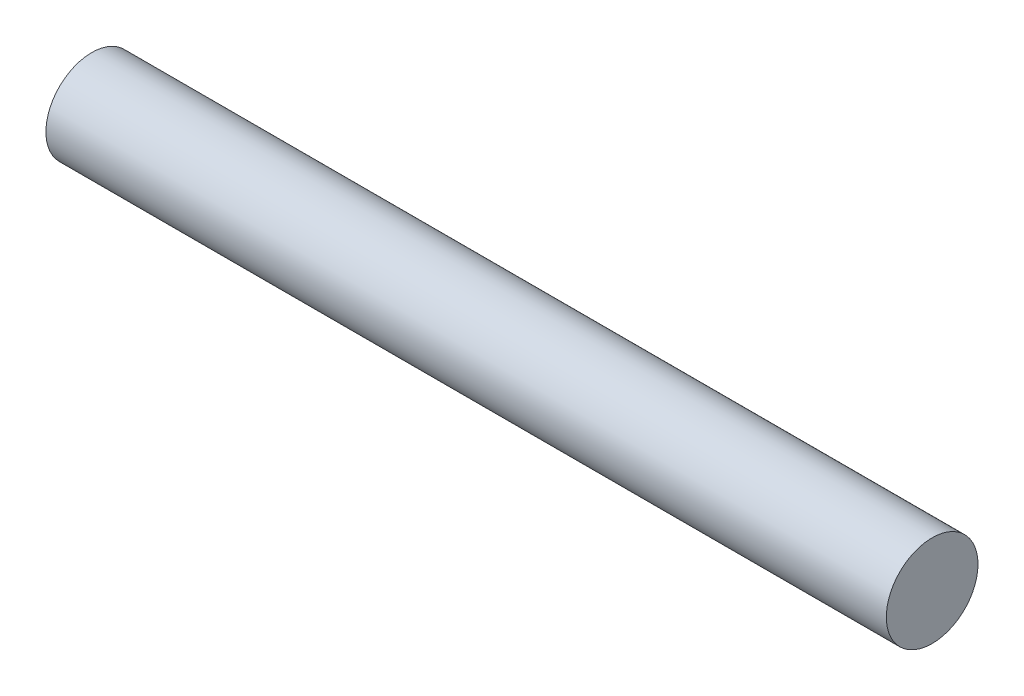
ISO-10303-21;
HEADER;
FILE_DESCRIPTION(('STEP AP214'),'2;1');
FILE_NAME('part.step','',(''),(''),'','','');
FILE_SCHEMA(('AUTOMOTIVE_DESIGN { 1 0 10303 214 1 1 1 1 }'));
ENDSEC;
DATA;
#1=APPLICATION_CONTEXT('core data for automotive mechanical design processes');
#2=APPLICATION_PROTOCOL_DEFINITION('international standard','automotive_design',2000,#1);
#3=PRODUCT_CONTEXT('',#1,'mechanical');
#4=PRODUCT('Part','Part','',(#3));
#5=PRODUCT_RELATED_PRODUCT_CATEGORY('part','',(#4));
#6=PRODUCT_DEFINITION_FORMATION('','',#4);
#7=PRODUCT_DEFINITION_CONTEXT('part definition',#1,'design');
#8=PRODUCT_DEFINITION('design','',#6,#7);
#9=PRODUCT_DEFINITION_SHAPE('','',#8);
#10=(LENGTH_UNIT() NAMED_UNIT(*) SI_UNIT(.MILLI.,.METRE.));
#11=(NAMED_UNIT(*) PLANE_ANGLE_UNIT() SI_UNIT($,.RADIAN.));
#12=(NAMED_UNIT(*) SI_UNIT($,.STERADIAN.) SOLID_ANGLE_UNIT());
#13=UNCERTAINTY_MEASURE_WITH_UNIT(LENGTH_MEASURE(1.E-05),#10,'distance_accuracy_value','');
#14=(GEOMETRIC_REPRESENTATION_CONTEXT(3) GLOBAL_UNCERTAINTY_ASSIGNED_CONTEXT((#13)) GLOBAL_UNIT_ASSIGNED_CONTEXT((#10,
#11,#12)) REPRESENTATION_CONTEXT('',''));
#15=CARTESIAN_POINT('',(0.,0.,0.));
#16=DIRECTION('',(0.,0.,1.));
#17=DIRECTION('',(1.,0.,0.));
#18=AXIS2_PLACEMENT_3D('',#15,#16,#17);
#19=CARTESIAN_POINT('',(110.,0.,0.));
#20=DIRECTION('',(-1.,0.,0.));
#21=DIRECTION('',(0.,0.,1.));
#22=AXIS2_PLACEMENT_3D('',#19,#20,#21);
#23=CYLINDRICAL_SURFACE('',#22,6.);
#24=CARTESIAN_POINT('',(110.,0.,0.));
#25=DIRECTION('',(1.,0.,0.));
#26=DIRECTION('',(0.,0.,-1.));
#27=AXIS2_PLACEMENT_3D('',#24,#25,#26);
#28=CIRCLE('',#27,6.);
#29=CARTESIAN_POINT('',(110.,0.,-6.));
#30=VERTEX_POINT('',#29);
#31=EDGE_CURVE('E10',#30,#30,#28,.T.);
#32=ORIENTED_EDGE('',*,*,#31,.F.);
#33=EDGE_LOOP('',(#32));
#34=FACE_BOUND('',#33,.T.);
#35=CARTESIAN_POINT('',(0.,0.,0.));
#36=DIRECTION('',(1.,0.,0.));
#37=DIRECTION('',(0.,0.,-1.));
#38=AXIS2_PLACEMENT_3D('',#35,#36,#37);
#39=CIRCLE('',#38,6.);
#40=CARTESIAN_POINT('',(0.,0.,-6.));
#41=VERTEX_POINT('',#40);
#42=EDGE_CURVE('E38',#41,#41,#39,.T.);
#43=ORIENTED_EDGE('',*,*,#42,.T.);
#44=EDGE_LOOP('',(#43));
#45=FACE_BOUND('',#44,.T.);
#46=ADVANCED_FACE('F35',(#34,#45),#23,.T.);
#47=CARTESIAN_POINT('',(110.,0.,0.));
#48=DIRECTION('',(1.,0.,0.));
#49=DIRECTION('',(0.,0.,-1.));
#50=AXIS2_PLACEMENT_3D('',#47,#48,#49);
#51=PLANE('',#50);
#52=ORIENTED_EDGE('',*,*,#31,.T.);
#53=EDGE_LOOP('',(#52));
#54=FACE_BOUND('',#53,.T.);
#55=ADVANCED_FACE('F50',(#54),#51,.T.);
#56=CARTESIAN_POINT('',(0.,0.,0.));
#57=DIRECTION('',(1.,0.,0.));
#58=DIRECTION('',(0.,0.,-1.));
#59=AXIS2_PLACEMENT_3D('',#56,#57,#58);
#60=PLANE('',#59);
#61=ORIENTED_EDGE('',*,*,#42,.F.);
#62=EDGE_LOOP('',(#61));
#63=FACE_BOUND('',#62,.T.);
#64=ADVANCED_FACE('F48',(#63),#60,.F.);
#65=CLOSED_SHELL('',(#46,#55,#64));
#66=MANIFOLD_SOLID_BREP('B2',#65);
#67=ADVANCED_BREP_SHAPE_REPRESENTATION('',(#18,#66),#14);
#68=SHAPE_DEFINITION_REPRESENTATION(#9,#67);
ENDSEC;
END-ISO-10303-21;
